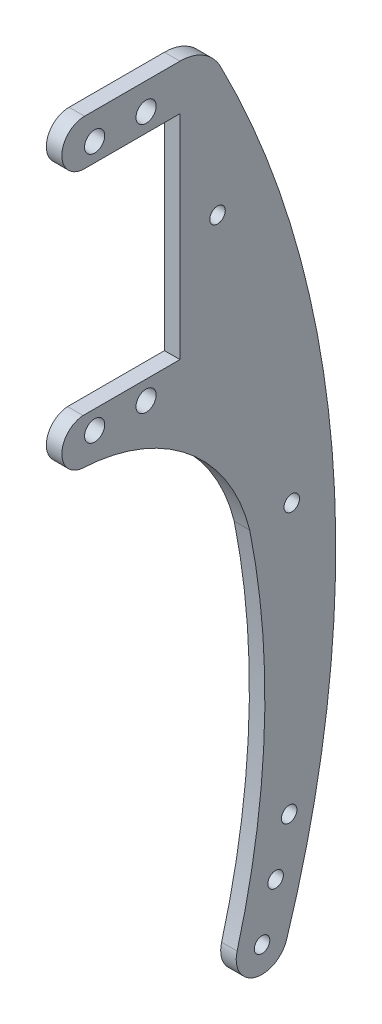
ISO-10303-21;
HEADER;
FILE_DESCRIPTION(('STEP AP214'),'2;1');
FILE_NAME('part.step','',(''),(''),'','','');
FILE_SCHEMA(('AUTOMOTIVE_DESIGN { 1 0 10303 214 1 1 1 1 }'));
ENDSEC;
DATA;
#1=APPLICATION_CONTEXT('core data for automotive mechanical design processes');
#2=APPLICATION_PROTOCOL_DEFINITION('international standard','automotive_design',2000,#1);
#3=PRODUCT_CONTEXT('',#1,'mechanical');
#4=PRODUCT('Part','Part','',(#3));
#5=PRODUCT_RELATED_PRODUCT_CATEGORY('part','',(#4));
#6=PRODUCT_DEFINITION_FORMATION('','',#4);
#7=PRODUCT_DEFINITION_CONTEXT('part definition',#1,'design');
#8=PRODUCT_DEFINITION('design','',#6,#7);
#9=PRODUCT_DEFINITION_SHAPE('','',#8);
#10=(LENGTH_UNIT() NAMED_UNIT(*) SI_UNIT(.MILLI.,.METRE.));
#11=(NAMED_UNIT(*) PLANE_ANGLE_UNIT() SI_UNIT($,.RADIAN.));
#12=(NAMED_UNIT(*) SI_UNIT($,.STERADIAN.) SOLID_ANGLE_UNIT());
#13=UNCERTAINTY_MEASURE_WITH_UNIT(LENGTH_MEASURE(1.E-05),#10,'distance_accuracy_value','');
#14=(GEOMETRIC_REPRESENTATION_CONTEXT(3) GLOBAL_UNCERTAINTY_ASSIGNED_CONTEXT((#13)) GLOBAL_UNIT_ASSIGNED_CONTEXT((#10,
#11,#12)) REPRESENTATION_CONTEXT('',''));
#15=CARTESIAN_POINT('',(0.,0.,0.));
#16=DIRECTION('',(0.,0.,1.));
#17=DIRECTION('',(1.,0.,0.));
#18=AXIS2_PLACEMENT_3D('',#15,#16,#17);
#19=CARTESIAN_POINT('',(3.,25.0125,6.925));
#20=DIRECTION('',(1.,0.,0.));
#21=DIRECTION('',(0.,0.,-1.));
#22=AXIS2_PLACEMENT_3D('',#19,#20,#21);
#23=PLANE('',#22);
#24=CARTESIAN_POINT('',(3.,-116.938856524657,-30.036135716593));
#25=DIRECTION('',(1.,0.,0.));
#26=DIRECTION('',(0.,0.,-1.));
#27=AXIS2_PLACEMENT_3D('',#24,#25,#26);
#28=CIRCLE('',#27,1.5);
#29=CARTESIAN_POINT('',(3.,-116.938856524657,-31.536135716593));
#30=VERTEX_POINT('',#29);
#31=EDGE_CURVE('E335',#30,#30,#28,.T.);
#32=ORIENTED_EDGE('',*,*,#31,.F.);
#33=EDGE_LOOP('',(#32));
#34=FACE_BOUND('',#33,.T.);
#35=CARTESIAN_POINT('',(3.,-55.4185287596542,-33.1598588616589));
#36=DIRECTION('',(1.,0.,0.));
#37=DIRECTION('',(0.,0.,-1.));
#38=AXIS2_PLACEMENT_3D('',#35,#36,#37);
#39=CIRCLE('',#38,1.5);
#40=CARTESIAN_POINT('',(3.,-55.4185287596542,-34.6598588616589));
#41=VERTEX_POINT('',#40);
#42=EDGE_CURVE('E351',#41,#41,#39,.T.);
#43=ORIENTED_EDGE('',*,*,#42,.F.);
#44=EDGE_LOOP('',(#43));
#45=FACE_BOUND('',#44,.T.);
#46=CARTESIAN_POINT('',(3.,-24.2125,4.975));
#47=DIRECTION('',(1.,0.,0.));
#48=DIRECTION('',(0.,0.,1.));
#49=AXIS2_PLACEMENT_3D('',#46,#47,#48);
#50=CIRCLE('',#49,1.95);
#51=CARTESIAN_POINT('',(3.,-24.2125,6.925));
#52=VERTEX_POINT('',#51);
#53=EDGE_CURVE('E367',#52,#52,#50,.T.);
#54=ORIENTED_EDGE('',*,*,#53,.F.);
#55=EDGE_LOOP('',(#54));
#56=FACE_BOUND('',#55,.T.);
#57=CARTESIAN_POINT('',(3.,24.2125,-4.975));
#58=DIRECTION('',(1.,0.,0.));
#59=DIRECTION('',(0.,0.,1.));
#60=AXIS2_PLACEMENT_3D('',#57,#58,#59);
#61=CIRCLE('',#60,1.95);
#62=CARTESIAN_POINT('',(3.,24.2125,-3.025));
#63=VERTEX_POINT('',#62);
#64=EDGE_CURVE('E383',#63,#63,#61,.T.);
#65=ORIENTED_EDGE('',*,*,#64,.F.);
#66=EDGE_LOOP('',(#65));
#67=FACE_BOUND('',#66,.T.);
#68=CARTESIAN_POINT('',(3.,25.0125,6.925));
#69=DIRECTION('',(1.,0.,0.));
#70=DIRECTION('',(0.,0.,-1.));
#71=AXIS2_PLACEMENT_3D('',#68,#69,#70);
#72=CIRCLE('',#71,4.4);
#73=CARTESIAN_POINT('',(3.,29.4125,6.925));
#74=VERTEX_POINT('',#73);
#75=CARTESIAN_POINT('',(3.,20.6125,6.925));
#76=VERTEX_POINT('',#75);
#77=EDGE_CURVE('E191',#74,#76,#72,.T.);
#78=ORIENTED_EDGE('',*,*,#77,.T.);
#79=DIRECTION('',(0.,0.,-1.));
#80=VECTOR('',#79,1.);
#81=CARTESIAN_POINT('',(3.,20.6125,6.925));
#82=LINE('',#81,#80);
#83=CARTESIAN_POINT('',(3.,20.6125,-11.525));
#84=VERTEX_POINT('',#83);
#85=EDGE_CURVE('E109',#76,#84,#82,.T.);
#86=ORIENTED_EDGE('',*,*,#85,.T.);
#87=DIRECTION('',(0.,-1.,0.));
#88=VECTOR('',#87,1.);
#89=CARTESIAN_POINT('',(3.,20.6125,-11.525));
#90=LINE('',#89,#88);
#91=CARTESIAN_POINT('',(3.,-20.5937907698934,-11.525));
#92=VERTEX_POINT('',#91);
#93=EDGE_CURVE('E224',#84,#92,#90,.T.);
#94=ORIENTED_EDGE('',*,*,#93,.T.);
#95=DIRECTION('',(0.,0.,1.));
#96=VECTOR('',#95,1.);
#97=CARTESIAN_POINT('',(3.,-20.5937907698934,7.21925667241328));
#98=LINE('',#97,#96);
#99=CARTESIAN_POINT('',(3.,-20.5937907698934,7.21925667241328));
#100=VERTEX_POINT('',#99);
#101=EDGE_CURVE('E244',#92,#100,#98,.T.);
#102=ORIENTED_EDGE('',*,*,#101,.T.);
#103=CARTESIAN_POINT('',(3.,-24.9839403129888,6.925));
#104=DIRECTION('',(1.,0.,0.));
#105=DIRECTION('',(0.,0.,1.));
#106=AXIS2_PLACEMENT_3D('',#103,#104,#105);
#107=CIRCLE('',#106,4.4);
#108=CARTESIAN_POINT('',(3.,-29.3740898560841,7.21925667241328));
#109=VERTEX_POINT('',#108);
#110=EDGE_CURVE('E240',#100,#109,#107,.T.);
#111=ORIENTED_EDGE('',*,*,#110,.T.);
#112=CARTESIAN_POINT('',(3.,-64.3313253612496,8.9489057224812));
#113=DIRECTION('',(-1.,0.,0.));
#114=DIRECTION('',(0.,0.,-1.));
#115=AXIS2_PLACEMENT_3D('',#112,#113,#114);
#116=CIRCLE('',#115,35.);
#117=CARTESIAN_POINT('',(3.,-55.9180653597128,-25.0248643972235));
#118=VERTEX_POINT('',#117);
#119=EDGE_CURVE('E243',#109,#118,#116,.T.);
#120=ORIENTED_EDGE('',*,*,#119,.T.);
#121=CARTESIAN_POINT('',(3.,-85.4486756139854,122.039553658302));
#122=DIRECTION('',(-1.,0.,0.));
#123=DIRECTION('',(0.,0.,-1.));
#124=AXIS2_PLACEMENT_3D('',#121,#122,#123);
#125=CIRCLE('',#124,150.);
#126=CARTESIAN_POINT('',(3.,-125.235333671732,-22.5876285744862));
#127=VERTEX_POINT('',#126);
#128=EDGE_CURVE('E248',#118,#127,#125,.T.);
#129=ORIENTED_EDGE('',*,*,#128,.T.);
#130=CARTESIAN_POINT('',(3.,-126.56155560699,-27.4085346489126));
#131=DIRECTION('',(1.,0.,0.));
#132=DIRECTION('',(0.,0.,-1.));
#133=AXIS2_PLACEMENT_3D('',#130,#131,#132);
#134=CIRCLE('',#133,5.00000000000009);
#135=CARTESIAN_POINT('',(3.,-128.084234421906,-32.17103916089));
#136=VERTEX_POINT('',#135);
#137=EDGE_CURVE('E137',#127,#136,#134,.T.);
#138=ORIENTED_EDGE('',*,*,#137,.T.);
#139=CARTESIAN_POINT('',(3.,-67.1770818252609,158.329141318208));
#140=DIRECTION('',(1.,0.,0.));
#141=DIRECTION('',(0.,0.,-1.));
#142=AXIS2_PLACEMENT_3D('',#139,#140,#141);
#143=CIRCLE('',#142,200.);
#144=CARTESIAN_POINT('',(3.,24.6530246865183,-19.3425546213401));
#145=VERTEX_POINT('',#144);
#146=EDGE_CURVE('E131',#136,#145,#143,.T.);
#147=ORIENTED_EDGE('',*,*,#146,.T.);
#148=CARTESIAN_POINT('',(3.,20.6125,-11.525));
#149=DIRECTION('',(1.,0.,0.));
#150=DIRECTION('',(0.,0.,1.));
#151=AXIS2_PLACEMENT_3D('',#148,#149,#150);
#152=CIRCLE('',#151,8.79999999999995);
#153=CARTESIAN_POINT('',(3.,29.4125,-11.525));
#154=VERTEX_POINT('',#153);
#155=EDGE_CURVE('E135',#145,#154,#152,.T.);
#156=ORIENTED_EDGE('',*,*,#155,.T.);
#157=DIRECTION('',(0.,0.,1.));
#158=VECTOR('',#157,1.);
#159=CARTESIAN_POINT('',(3.,29.4125,6.925));
#160=LINE('',#159,#158);
#161=EDGE_CURVE('E57',#154,#74,#160,.T.);
#162=ORIENTED_EDGE('',*,*,#161,.T.);
#163=EDGE_LOOP('',(#78,#86,#94,#102,#111,#120,#129,#138,#147,#156,#162));
#164=FACE_BOUND('',#163,.T.);
#165=CARTESIAN_POINT('',(3.,24.2125,4.975));
#166=DIRECTION('',(1.,0.,0.));
#167=DIRECTION('',(0.,0.,-1.));
#168=AXIS2_PLACEMENT_3D('',#165,#166,#167);
#169=CIRCLE('',#168,1.95);
#170=CARTESIAN_POINT('',(3.,24.2125,3.025));
#171=VERTEX_POINT('',#170);
#172=EDGE_CURVE('E164',#171,#171,#169,.T.);
#173=ORIENTED_EDGE('',*,*,#172,.F.);
#174=EDGE_LOOP('',(#173));
#175=FACE_BOUND('',#174,.T.);
#176=CARTESIAN_POINT('',(3.,-24.2125,-4.975));
#177=DIRECTION('',(1.,0.,0.));
#178=DIRECTION('',(0.,0.,-1.));
#179=AXIS2_PLACEMENT_3D('',#176,#177,#178);
#180=CIRCLE('',#179,1.95);
#181=CARTESIAN_POINT('',(3.,-24.2125,-6.925));
#182=VERTEX_POINT('',#181);
#183=EDGE_CURVE('E375',#182,#182,#180,.T.);
#184=ORIENTED_EDGE('',*,*,#183,.F.);
#185=EDGE_LOOP('',(#184));
#186=FACE_BOUND('',#185,.T.);
#187=CARTESIAN_POINT('',(3.,0.,-18.795));
#188=DIRECTION('',(1.,0.,0.));
#189=DIRECTION('',(0.,0.,-1.));
#190=AXIS2_PLACEMENT_3D('',#187,#188,#189);
#191=CIRCLE('',#190,1.5);
#192=CARTESIAN_POINT('',(3.,0.,-20.295));
#193=VERTEX_POINT('',#192);
#194=EDGE_CURVE('E359',#193,#193,#191,.T.);
#195=ORIENTED_EDGE('',*,*,#194,.F.);
#196=EDGE_LOOP('',(#195));
#197=FACE_BOUND('',#196,.T.);
#198=CARTESIAN_POINT('',(3.,-107.316157442325,-32.6637367842734));
#199=DIRECTION('',(1.,0.,0.));
#200=DIRECTION('',(0.,0.,-1.));
#201=AXIS2_PLACEMENT_3D('',#198,#199,#200);
#202=CIRCLE('',#201,1.49999999999999);
#203=CARTESIAN_POINT('',(3.,-107.316157442325,-34.1637367842734));
#204=VERTEX_POINT('',#203);
#205=EDGE_CURVE('E343',#204,#204,#202,.T.);
#206=ORIENTED_EDGE('',*,*,#205,.F.);
#207=EDGE_LOOP('',(#206));
#208=FACE_BOUND('',#207,.T.);
#209=CARTESIAN_POINT('',(3.,-126.56155560699,-27.4085346489126));
#210=DIRECTION('',(1.,0.,0.));
#211=DIRECTION('',(0.,0.,-1.));
#212=AXIS2_PLACEMENT_3D('',#209,#210,#211);
#213=CIRCLE('',#212,1.5);
#214=CARTESIAN_POINT('',(3.,-126.56155560699,-28.9085346489126));
#215=VERTEX_POINT('',#214);
#216=EDGE_CURVE('E324',#215,#215,#213,.T.);
#217=ORIENTED_EDGE('',*,*,#216,.F.);
#218=EDGE_LOOP('',(#217));
#219=FACE_BOUND('',#218,.T.);
#220=ADVANCED_FACE('F39',(#34,#45,#56,#67,#164,#175,#186,#197,#208,#219),#23,.T.);
#221=CARTESIAN_POINT('',(0.,25.0125,6.925));
#222=DIRECTION('',(1.,0.,0.));
#223=DIRECTION('',(0.,0.,-1.));
#224=AXIS2_PLACEMENT_3D('',#221,#222,#223);
#225=PLANE('',#224);
#226=CARTESIAN_POINT('',(0.,25.0125,6.925));
#227=DIRECTION('',(1.,0.,0.));
#228=DIRECTION('',(0.,0.,-1.));
#229=AXIS2_PLACEMENT_3D('',#226,#227,#228);
#230=CIRCLE('',#229,4.4);
#231=CARTESIAN_POINT('',(0.,29.4125,6.925));
#232=VERTEX_POINT('',#231);
#233=CARTESIAN_POINT('',(0.,20.6125,6.925));
#234=VERTEX_POINT('',#233);
#235=EDGE_CURVE('E159',#232,#234,#230,.T.);
#236=ORIENTED_EDGE('',*,*,#235,.F.);
#237=DIRECTION('',(0.,0.,1.));
#238=VECTOR('',#237,1.);
#239=CARTESIAN_POINT('',(0.,29.4125,6.925));
#240=LINE('',#239,#238);
#241=CARTESIAN_POINT('',(0.,29.4125,-11.525));
#242=VERTEX_POINT('',#241);
#243=EDGE_CURVE('E101',#242,#232,#240,.T.);
#244=ORIENTED_EDGE('',*,*,#243,.F.);
#245=CARTESIAN_POINT('',(0.,20.6125,-11.525));
#246=DIRECTION('',(1.,0.,0.));
#247=DIRECTION('',(0.,0.,1.));
#248=AXIS2_PLACEMENT_3D('',#245,#246,#247);
#249=CIRCLE('',#248,8.79999999999995);
#250=CARTESIAN_POINT('',(0.,24.6530246865183,-19.3425546213401));
#251=VERTEX_POINT('',#250);
#252=EDGE_CURVE('E95',#251,#242,#249,.T.);
#253=ORIENTED_EDGE('',*,*,#252,.F.);
#254=CARTESIAN_POINT('',(0.,-67.1770818252609,158.329141318208));
#255=DIRECTION('',(1.,0.,0.));
#256=DIRECTION('',(0.,0.,-1.));
#257=AXIS2_PLACEMENT_3D('',#254,#255,#256);
#258=CIRCLE('',#257,200.);
#259=CARTESIAN_POINT('',(0.,-128.084234421906,-32.17103916089));
#260=VERTEX_POINT('',#259);
#261=EDGE_CURVE('E146',#260,#251,#258,.T.);
#262=ORIENTED_EDGE('',*,*,#261,.F.);
#263=CARTESIAN_POINT('',(0.,-126.56155560699,-27.4085346489126));
#264=DIRECTION('',(1.,0.,0.));
#265=DIRECTION('',(0.,0.,-1.));
#266=AXIS2_PLACEMENT_3D('',#263,#264,#265);
#267=CIRCLE('',#266,5.00000000000009);
#268=CARTESIAN_POINT('',(0.,-125.235333671732,-22.5876285744862));
#269=VERTEX_POINT('',#268);
#270=EDGE_CURVE('E182',#269,#260,#267,.T.);
#271=ORIENTED_EDGE('',*,*,#270,.F.);
#272=CARTESIAN_POINT('',(0.,-85.4486756139854,122.039553658302));
#273=DIRECTION('',(-1.,0.,0.));
#274=DIRECTION('',(0.,0.,-1.));
#275=AXIS2_PLACEMENT_3D('',#272,#273,#274);
#276=CIRCLE('',#275,150.);
#277=CARTESIAN_POINT('',(0.,-55.9180653597128,-25.0248643972235));
#278=VERTEX_POINT('',#277);
#279=EDGE_CURVE('E179',#278,#269,#276,.T.);
#280=ORIENTED_EDGE('',*,*,#279,.F.);
#281=CARTESIAN_POINT('',(0.,-64.3313253612496,8.9489057224812));
#282=DIRECTION('',(-1.,0.,0.));
#283=DIRECTION('',(0.,0.,-1.));
#284=AXIS2_PLACEMENT_3D('',#281,#282,#283);
#285=CIRCLE('',#284,35.);
#286=CARTESIAN_POINT('',(0.,-29.3740898560841,7.21925667241328));
#287=VERTEX_POINT('',#286);
#288=EDGE_CURVE('E176',#287,#278,#285,.T.);
#289=ORIENTED_EDGE('',*,*,#288,.F.);
#290=CARTESIAN_POINT('',(0.,-24.9839403129888,6.925));
#291=DIRECTION('',(1.,0.,0.));
#292=DIRECTION('',(0.,0.,1.));
#293=AXIS2_PLACEMENT_3D('',#290,#291,#292);
#294=CIRCLE('',#293,4.4);
#295=CARTESIAN_POINT('',(0.,-20.5937907698934,7.21925667241328));
#296=VERTEX_POINT('',#295);
#297=EDGE_CURVE('E173',#296,#287,#294,.T.);
#298=ORIENTED_EDGE('',*,*,#297,.F.);
#299=DIRECTION('',(0.,0.,1.));
#300=VECTOR('',#299,1.);
#301=CARTESIAN_POINT('',(0.,-20.5937907698934,7.21925667241328));
#302=LINE('',#301,#300);
#303=CARTESIAN_POINT('',(0.,-20.5937907698934,-11.525));
#304=VERTEX_POINT('',#303);
#305=EDGE_CURVE('E170',#304,#296,#302,.T.);
#306=ORIENTED_EDGE('',*,*,#305,.F.);
#307=DIRECTION('',(0.,-1.,0.));
#308=VECTOR('',#307,1.);
#309=CARTESIAN_POINT('',(0.,20.6125,-11.525));
#310=LINE('',#309,#308);
#311=CARTESIAN_POINT('',(0.,20.6125,-11.525));
#312=VERTEX_POINT('',#311);
#313=EDGE_CURVE('E167',#312,#304,#310,.T.);
#314=ORIENTED_EDGE('',*,*,#313,.F.);
#315=DIRECTION('',(0.,0.,-1.));
#316=VECTOR('',#315,1.);
#317=CARTESIAN_POINT('',(0.,20.6125,6.925));
#318=LINE('',#317,#316);
#319=EDGE_CURVE('E163',#234,#312,#318,.T.);
#320=ORIENTED_EDGE('',*,*,#319,.F.);
#321=EDGE_LOOP('',(#236,#244,#253,#262,#271,#280,#289,#298,#306,#314,#320));
#322=FACE_BOUND('',#321,.T.);
#323=CARTESIAN_POINT('',(0.,24.2125,4.975));
#324=DIRECTION('',(1.,0.,0.));
#325=DIRECTION('',(0.,0.,-1.));
#326=AXIS2_PLACEMENT_3D('',#323,#324,#325);
#327=CIRCLE('',#326,1.95);
#328=CARTESIAN_POINT('',(0.,24.2125,3.025));
#329=VERTEX_POINT('',#328);
#330=EDGE_CURVE('E387',#329,#329,#327,.T.);
#331=ORIENTED_EDGE('',*,*,#330,.T.);
#332=EDGE_LOOP('',(#331));
#333=FACE_BOUND('',#332,.T.);
#334=CARTESIAN_POINT('',(0.,24.2125,-4.975));
#335=DIRECTION('',(1.,0.,0.));
#336=DIRECTION('',(0.,0.,1.));
#337=AXIS2_PLACEMENT_3D('',#334,#335,#336);
#338=CIRCLE('',#337,1.95);
#339=CARTESIAN_POINT('',(0.,24.2125,-3.025));
#340=VERTEX_POINT('',#339);
#341=EDGE_CURVE('E379',#340,#340,#338,.T.);
#342=ORIENTED_EDGE('',*,*,#341,.T.);
#343=EDGE_LOOP('',(#342));
#344=FACE_BOUND('',#343,.T.);
#345=CARTESIAN_POINT('',(0.,-24.2125,-4.975));
#346=DIRECTION('',(1.,0.,0.));
#347=DIRECTION('',(0.,0.,-1.));
#348=AXIS2_PLACEMENT_3D('',#345,#346,#347);
#349=CIRCLE('',#348,1.95);
#350=CARTESIAN_POINT('',(0.,-24.2125,-6.925));
#351=VERTEX_POINT('',#350);
#352=EDGE_CURVE('E371',#351,#351,#349,.T.);
#353=ORIENTED_EDGE('',*,*,#352,.T.);
#354=EDGE_LOOP('',(#353));
#355=FACE_BOUND('',#354,.T.);
#356=CARTESIAN_POINT('',(0.,-24.2125,4.975));
#357=DIRECTION('',(1.,0.,0.));
#358=DIRECTION('',(0.,0.,1.));
#359=AXIS2_PLACEMENT_3D('',#356,#357,#358);
#360=CIRCLE('',#359,1.95);
#361=CARTESIAN_POINT('',(0.,-24.2125,6.925));
#362=VERTEX_POINT('',#361);
#363=EDGE_CURVE('E363',#362,#362,#360,.T.);
#364=ORIENTED_EDGE('',*,*,#363,.T.);
#365=EDGE_LOOP('',(#364));
#366=FACE_BOUND('',#365,.T.);
#367=CARTESIAN_POINT('',(0.,0.,-18.795));
#368=DIRECTION('',(1.,0.,0.));
#369=DIRECTION('',(0.,0.,-1.));
#370=AXIS2_PLACEMENT_3D('',#367,#368,#369);
#371=CIRCLE('',#370,1.5);
#372=CARTESIAN_POINT('',(0.,0.,-20.295));
#373=VERTEX_POINT('',#372);
#374=EDGE_CURVE('E355',#373,#373,#371,.T.);
#375=ORIENTED_EDGE('',*,*,#374,.T.);
#376=EDGE_LOOP('',(#375));
#377=FACE_BOUND('',#376,.T.);
#378=CARTESIAN_POINT('',(0.,-55.4185287596542,-33.1598588616589));
#379=DIRECTION('',(1.,0.,0.));
#380=DIRECTION('',(0.,0.,-1.));
#381=AXIS2_PLACEMENT_3D('',#378,#379,#380);
#382=CIRCLE('',#381,1.5);
#383=CARTESIAN_POINT('',(0.,-55.4185287596542,-34.6598588616589));
#384=VERTEX_POINT('',#383);
#385=EDGE_CURVE('E347',#384,#384,#382,.T.);
#386=ORIENTED_EDGE('',*,*,#385,.T.);
#387=EDGE_LOOP('',(#386));
#388=FACE_BOUND('',#387,.T.);
#389=CARTESIAN_POINT('',(0.,-107.316157442325,-32.6637367842734));
#390=DIRECTION('',(1.,0.,0.));
#391=DIRECTION('',(0.,0.,-1.));
#392=AXIS2_PLACEMENT_3D('',#389,#390,#391);
#393=CIRCLE('',#392,1.49999999999999);
#394=CARTESIAN_POINT('',(0.,-107.316157442325,-34.1637367842734));
#395=VERTEX_POINT('',#394);
#396=EDGE_CURVE('E339',#395,#395,#393,.T.);
#397=ORIENTED_EDGE('',*,*,#396,.T.);
#398=EDGE_LOOP('',(#397));
#399=FACE_BOUND('',#398,.T.);
#400=CARTESIAN_POINT('',(0.,-116.938856524657,-30.036135716593));
#401=DIRECTION('',(1.,0.,0.));
#402=DIRECTION('',(0.,0.,-1.));
#403=AXIS2_PLACEMENT_3D('',#400,#401,#402);
#404=CIRCLE('',#403,1.5);
#405=CARTESIAN_POINT('',(0.,-116.938856524657,-31.536135716593));
#406=VERTEX_POINT('',#405);
#407=EDGE_CURVE('E332',#406,#406,#404,.T.);
#408=ORIENTED_EDGE('',*,*,#407,.T.);
#409=EDGE_LOOP('',(#408));
#410=FACE_BOUND('',#409,.T.);
#411=CARTESIAN_POINT('',(0.,-126.56155560699,-27.4085346489126));
#412=DIRECTION('',(1.,0.,0.));
#413=DIRECTION('',(0.,0.,-1.));
#414=AXIS2_PLACEMENT_3D('',#411,#412,#413);
#415=CIRCLE('',#414,1.5);
#416=CARTESIAN_POINT('',(0.,-126.56155560699,-28.9085346489126));
#417=VERTEX_POINT('',#416);
#418=EDGE_CURVE('E327',#417,#417,#415,.T.);
#419=ORIENTED_EDGE('',*,*,#418,.T.);
#420=EDGE_LOOP('',(#419));
#421=FACE_BOUND('',#420,.T.);
#422=ADVANCED_FACE('F228',(#322,#333,#344,#355,#366,#377,#388,#399,#410,#421),#225,.F.);
#423=CARTESIAN_POINT('',(3.,25.0125,6.925));
#424=DIRECTION('',(-1.,0.,0.));
#425=DIRECTION('',(0.,0.,1.));
#426=AXIS2_PLACEMENT_3D('',#423,#424,#425);
#427=CYLINDRICAL_SURFACE('',#426,4.4);
#428=ORIENTED_EDGE('',*,*,#235,.T.);
#429=DIRECTION('',(-1.,0.,0.));
#430=VECTOR('',#429,1.);
#431=CARTESIAN_POINT('',(3.,20.6125,6.925));
#432=LINE('',#431,#430);
#433=EDGE_CURVE('E11',#76,#234,#432,.T.);
#434=ORIENTED_EDGE('',*,*,#433,.F.);
#435=ORIENTED_EDGE('',*,*,#77,.F.);
#436=DIRECTION('',(-1.,0.,0.));
#437=VECTOR('',#436,1.);
#438=CARTESIAN_POINT('',(3.,29.4125,6.925));
#439=LINE('',#438,#437);
#440=EDGE_CURVE('E155',#74,#232,#439,.T.);
#441=ORIENTED_EDGE('',*,*,#440,.T.);
#442=EDGE_LOOP('',(#428,#434,#435,#441));
#443=FACE_BOUND('',#442,.T.);
#444=ADVANCED_FACE('F41',(#443),#427,.T.);
#445=CARTESIAN_POINT('',(3.,20.6125,6.925));
#446=DIRECTION('',(0.,1.,0.));
#447=DIRECTION('',(0.,0.,1.));
#448=AXIS2_PLACEMENT_3D('',#445,#446,#447);
#449=PLANE('',#448);
#450=ORIENTED_EDGE('',*,*,#319,.T.);
#451=DIRECTION('',(-1.,0.,0.));
#452=VECTOR('',#451,1.);
#453=CARTESIAN_POINT('',(3.,20.6125,-11.525));
#454=LINE('',#453,#452);
#455=EDGE_CURVE('E49',#84,#312,#454,.T.);
#456=ORIENTED_EDGE('',*,*,#455,.F.);
#457=ORIENTED_EDGE('',*,*,#85,.F.);
#458=ORIENTED_EDGE('',*,*,#433,.T.);
#459=EDGE_LOOP('',(#450,#456,#457,#458));
#460=FACE_BOUND('',#459,.T.);
#461=ADVANCED_FACE('F538',(#460),#449,.F.);
#462=CARTESIAN_POINT('',(3.,20.6125,-11.525));
#463=DIRECTION('',(0.,0.,-1.));
#464=DIRECTION('',(0.,1.,0.));
#465=AXIS2_PLACEMENT_3D('',#462,#463,#464);
#466=PLANE('',#465);
#467=ORIENTED_EDGE('',*,*,#313,.T.);
#468=DIRECTION('',(-1.,0.,0.));
#469=VECTOR('',#468,1.);
#470=CARTESIAN_POINT('',(3.,-20.5937907698934,-11.525));
#471=LINE('',#470,#469);
#472=EDGE_CURVE('E214',#92,#304,#471,.T.);
#473=ORIENTED_EDGE('',*,*,#472,.F.);
#474=ORIENTED_EDGE('',*,*,#93,.F.);
#475=ORIENTED_EDGE('',*,*,#455,.T.);
#476=EDGE_LOOP('',(#467,#473,#474,#475));
#477=FACE_BOUND('',#476,.T.);
#478=ADVANCED_FACE('F222',(#477),#466,.F.);
#479=CARTESIAN_POINT('',(3.,-20.5937907698934,7.21925667241328));
#480=DIRECTION('',(0.,-1.,0.));
#481=DIRECTION('',(0.,0.,-1.));
#482=AXIS2_PLACEMENT_3D('',#479,#480,#481);
#483=PLANE('',#482);
#484=ORIENTED_EDGE('',*,*,#305,.T.);
#485=DIRECTION('',(-1.,0.,0.));
#486=VECTOR('',#485,1.);
#487=CARTESIAN_POINT('',(3.,-20.5937907698934,7.21925667241328));
#488=LINE('',#487,#486);
#489=EDGE_CURVE('E210',#100,#296,#488,.T.);
#490=ORIENTED_EDGE('',*,*,#489,.F.);
#491=ORIENTED_EDGE('',*,*,#101,.F.);
#492=ORIENTED_EDGE('',*,*,#472,.T.);
#493=EDGE_LOOP('',(#484,#490,#491,#492));
#494=FACE_BOUND('',#493,.T.);
#495=ADVANCED_FACE('F234',(#494),#483,.F.);
#496=CARTESIAN_POINT('',(3.,-24.9839403129888,6.925));
#497=DIRECTION('',(-1.,0.,0.));
#498=DIRECTION('',(0.,0.,1.));
#499=AXIS2_PLACEMENT_3D('',#496,#497,#498);
#500=CYLINDRICAL_SURFACE('',#499,4.4);
#501=ORIENTED_EDGE('',*,*,#297,.T.);
#502=DIRECTION('',(-1.,0.,0.));
#503=VECTOR('',#502,1.);
#504=CARTESIAN_POINT('',(3.,-29.3740898560841,7.21925667241328));
#505=LINE('',#504,#503);
#506=EDGE_CURVE('E206',#109,#287,#505,.T.);
#507=ORIENTED_EDGE('',*,*,#506,.F.);
#508=ORIENTED_EDGE('',*,*,#110,.F.);
#509=ORIENTED_EDGE('',*,*,#489,.T.);
#510=EDGE_LOOP('',(#501,#507,#508,#509));
#511=FACE_BOUND('',#510,.T.);
#512=ADVANCED_FACE('F238',(#511),#500,.T.);
#513=CARTESIAN_POINT('',(3.,-64.3313253612496,8.9489057224812));
#514=DIRECTION('',(-1.,0.,0.));
#515=DIRECTION('',(0.,0.,1.));
#516=AXIS2_PLACEMENT_3D('',#513,#514,#515);
#517=CYLINDRICAL_SURFACE('',#516,35.);
#518=ORIENTED_EDGE('',*,*,#288,.T.);
#519=DIRECTION('',(-1.,0.,0.));
#520=VECTOR('',#519,1.);
#521=CARTESIAN_POINT('',(3.,-55.9180653597128,-25.0248643972235));
#522=LINE('',#521,#520);
#523=EDGE_CURVE('E202',#118,#278,#522,.T.);
#524=ORIENTED_EDGE('',*,*,#523,.F.);
#525=ORIENTED_EDGE('',*,*,#119,.F.);
#526=ORIENTED_EDGE('',*,*,#506,.T.);
#527=EDGE_LOOP('',(#518,#524,#525,#526));
#528=FACE_BOUND('',#527,.T.);
#529=ADVANCED_FACE('F504',(#528),#517,.F.);
#530=CARTESIAN_POINT('',(3.,-85.4486756139854,122.039553658302));
#531=DIRECTION('',(-1.,0.,0.));
#532=DIRECTION('',(0.,0.,1.));
#533=AXIS2_PLACEMENT_3D('',#530,#531,#532);
#534=CYLINDRICAL_SURFACE('',#533,150.);
#535=ORIENTED_EDGE('',*,*,#279,.T.);
#536=DIRECTION('',(-1.,0.,0.));
#537=VECTOR('',#536,1.);
#538=CARTESIAN_POINT('',(3.,-125.235333671732,-22.5876285744862));
#539=LINE('',#538,#537);
#540=EDGE_CURVE('E198',#127,#269,#539,.T.);
#541=ORIENTED_EDGE('',*,*,#540,.F.);
#542=ORIENTED_EDGE('',*,*,#128,.F.);
#543=ORIENTED_EDGE('',*,*,#523,.T.);
#544=EDGE_LOOP('',(#535,#541,#542,#543));
#545=FACE_BOUND('',#544,.T.);
#546=ADVANCED_FACE('F259',(#545),#534,.F.);
#547=CARTESIAN_POINT('',(3.,-126.56155560699,-27.4085346489126));
#548=DIRECTION('',(-1.,0.,0.));
#549=DIRECTION('',(0.,0.,1.));
#550=AXIS2_PLACEMENT_3D('',#547,#548,#549);
#551=CYLINDRICAL_SURFACE('',#550,5.00000000000009);
#552=ORIENTED_EDGE('',*,*,#270,.T.);
#553=DIRECTION('',(-1.,0.,0.));
#554=VECTOR('',#553,1.);
#555=CARTESIAN_POINT('',(3.,-128.084234421906,-32.17103916089));
#556=LINE('',#555,#554);
#557=EDGE_CURVE('E148',#136,#260,#556,.T.);
#558=ORIENTED_EDGE('',*,*,#557,.F.);
#559=ORIENTED_EDGE('',*,*,#137,.F.);
#560=ORIENTED_EDGE('',*,*,#540,.T.);
#561=EDGE_LOOP('',(#552,#558,#559,#560));
#562=FACE_BOUND('',#561,.T.);
#563=ADVANCED_FACE('F263',(#562),#551,.T.);
#564=CARTESIAN_POINT('',(3.,-67.1770818252609,158.329141318208));
#565=DIRECTION('',(-1.,0.,0.));
#566=DIRECTION('',(0.,0.,1.));
#567=AXIS2_PLACEMENT_3D('',#564,#565,#566);
#568=CYLINDRICAL_SURFACE('',#567,200.);
#569=ORIENTED_EDGE('',*,*,#261,.T.);
#570=DIRECTION('',(-1.,0.,0.));
#571=VECTOR('',#570,1.);
#572=CARTESIAN_POINT('',(3.,24.6530246865183,-19.3425546213401));
#573=LINE('',#572,#571);
#574=EDGE_CURVE('E143',#145,#251,#573,.T.);
#575=ORIENTED_EDGE('',*,*,#574,.F.);
#576=ORIENTED_EDGE('',*,*,#146,.F.);
#577=ORIENTED_EDGE('',*,*,#557,.T.);
#578=EDGE_LOOP('',(#569,#575,#576,#577));
#579=FACE_BOUND('',#578,.T.);
#580=ADVANCED_FACE('F144',(#579),#568,.T.);
#581=CARTESIAN_POINT('',(3.,20.6125,-11.525));
#582=DIRECTION('',(-1.,0.,0.));
#583=DIRECTION('',(0.,0.,1.));
#584=AXIS2_PLACEMENT_3D('',#581,#582,#583);
#585=CYLINDRICAL_SURFACE('',#584,8.79999999999995);
#586=ORIENTED_EDGE('',*,*,#252,.T.);
#587=DIRECTION('',(-1.,0.,0.));
#588=VECTOR('',#587,1.);
#589=CARTESIAN_POINT('',(3.,29.4125,-11.525));
#590=LINE('',#589,#588);
#591=EDGE_CURVE('E149',#154,#242,#590,.T.);
#592=ORIENTED_EDGE('',*,*,#591,.F.);
#593=ORIENTED_EDGE('',*,*,#155,.F.);
#594=ORIENTED_EDGE('',*,*,#574,.T.);
#595=EDGE_LOOP('',(#586,#592,#593,#594));
#596=FACE_BOUND('',#595,.T.);
#597=ADVANCED_FACE('F151',(#596),#585,.T.);
#598=CARTESIAN_POINT('',(3.,29.4125,6.925));
#599=DIRECTION('',(0.,-1.,0.));
#600=DIRECTION('',(0.,0.,-1.));
#601=AXIS2_PLACEMENT_3D('',#598,#599,#600);
#602=PLANE('',#601);
#603=ORIENTED_EDGE('',*,*,#243,.T.);
#604=ORIENTED_EDGE('',*,*,#440,.F.);
#605=ORIENTED_EDGE('',*,*,#161,.F.);
#606=ORIENTED_EDGE('',*,*,#591,.T.);
#607=EDGE_LOOP('',(#603,#604,#605,#606));
#608=FACE_BOUND('',#607,.T.);
#609=ADVANCED_FACE('F267',(#608),#602,.F.);
#610=CARTESIAN_POINT('',(3.,24.2125,4.975));
#611=DIRECTION('',(-1.,0.,0.));
#612=DIRECTION('',(0.,0.,1.));
#613=AXIS2_PLACEMENT_3D('',#610,#611,#612);
#614=CYLINDRICAL_SURFACE('',#613,1.95);
#615=ORIENTED_EDGE('',*,*,#172,.T.);
#616=EDGE_LOOP('',(#615));
#617=FACE_BOUND('',#616,.T.);
#618=ORIENTED_EDGE('',*,*,#330,.F.);
#619=EDGE_LOOP('',(#618));
#620=FACE_BOUND('',#619,.T.);
#621=ADVANCED_FACE('F269',(#617,#620),#614,.F.);
#622=CARTESIAN_POINT('',(3.,24.2125,-4.975));
#623=DIRECTION('',(-1.,0.,0.));
#624=DIRECTION('',(0.,0.,1.));
#625=AXIS2_PLACEMENT_3D('',#622,#623,#624);
#626=CYLINDRICAL_SURFACE('',#625,1.95);
#627=ORIENTED_EDGE('',*,*,#64,.T.);
#628=EDGE_LOOP('',(#627));
#629=FACE_BOUND('',#628,.T.);
#630=ORIENTED_EDGE('',*,*,#341,.F.);
#631=EDGE_LOOP('',(#630));
#632=FACE_BOUND('',#631,.T.);
#633=ADVANCED_FACE('F275',(#629,#632),#626,.F.);
#634=CARTESIAN_POINT('',(3.,-24.2125,-4.975));
#635=DIRECTION('',(-1.,0.,0.));
#636=DIRECTION('',(0.,0.,1.));
#637=AXIS2_PLACEMENT_3D('',#634,#635,#636);
#638=CYLINDRICAL_SURFACE('',#637,1.95);
#639=ORIENTED_EDGE('',*,*,#183,.T.);
#640=EDGE_LOOP('',(#639));
#641=FACE_BOUND('',#640,.T.);
#642=ORIENTED_EDGE('',*,*,#352,.F.);
#643=EDGE_LOOP('',(#642));
#644=FACE_BOUND('',#643,.T.);
#645=ADVANCED_FACE('F291',(#641,#644),#638,.F.);
#646=CARTESIAN_POINT('',(3.,-24.2125,4.975));
#647=DIRECTION('',(-1.,0.,0.));
#648=DIRECTION('',(0.,0.,1.));
#649=AXIS2_PLACEMENT_3D('',#646,#647,#648);
#650=CYLINDRICAL_SURFACE('',#649,1.95);
#651=ORIENTED_EDGE('',*,*,#53,.T.);
#652=EDGE_LOOP('',(#651));
#653=FACE_BOUND('',#652,.T.);
#654=ORIENTED_EDGE('',*,*,#363,.F.);
#655=EDGE_LOOP('',(#654));
#656=FACE_BOUND('',#655,.T.);
#657=ADVANCED_FACE('F295',(#653,#656),#650,.F.);
#658=CARTESIAN_POINT('',(3.,0.,-18.795));
#659=DIRECTION('',(-1.,0.,0.));
#660=DIRECTION('',(0.,0.,1.));
#661=AXIS2_PLACEMENT_3D('',#658,#659,#660);
#662=CYLINDRICAL_SURFACE('',#661,1.5);
#663=ORIENTED_EDGE('',*,*,#194,.T.);
#664=EDGE_LOOP('',(#663));
#665=FACE_BOUND('',#664,.T.);
#666=ORIENTED_EDGE('',*,*,#374,.F.);
#667=EDGE_LOOP('',(#666));
#668=FACE_BOUND('',#667,.T.);
#669=ADVANCED_FACE('F299',(#665,#668),#662,.F.);
#670=CARTESIAN_POINT('',(3.,-55.4185287596542,-33.1598588616589));
#671=DIRECTION('',(-1.,0.,0.));
#672=DIRECTION('',(0.,0.,1.));
#673=AXIS2_PLACEMENT_3D('',#670,#671,#672);
#674=CYLINDRICAL_SURFACE('',#673,1.5);
#675=ORIENTED_EDGE('',*,*,#42,.T.);
#676=EDGE_LOOP('',(#675));
#677=FACE_BOUND('',#676,.T.);
#678=ORIENTED_EDGE('',*,*,#385,.F.);
#679=EDGE_LOOP('',(#678));
#680=FACE_BOUND('',#679,.T.);
#681=ADVANCED_FACE('F303',(#677,#680),#674,.F.);
#682=CARTESIAN_POINT('',(3.,-107.316157442325,-32.6637367842734));
#683=DIRECTION('',(-1.,0.,0.));
#684=DIRECTION('',(0.,0.,1.));
#685=AXIS2_PLACEMENT_3D('',#682,#683,#684);
#686=CYLINDRICAL_SURFACE('',#685,1.49999999999999);
#687=ORIENTED_EDGE('',*,*,#205,.T.);
#688=EDGE_LOOP('',(#687));
#689=FACE_BOUND('',#688,.T.);
#690=ORIENTED_EDGE('',*,*,#396,.F.);
#691=EDGE_LOOP('',(#690));
#692=FACE_BOUND('',#691,.T.);
#693=ADVANCED_FACE('F307',(#689,#692),#686,.F.);
#694=CARTESIAN_POINT('',(3.,-116.938856524657,-30.036135716593));
#695=DIRECTION('',(-1.,0.,0.));
#696=DIRECTION('',(0.,0.,1.));
#697=AXIS2_PLACEMENT_3D('',#694,#695,#696);
#698=CYLINDRICAL_SURFACE('',#697,1.5);
#699=ORIENTED_EDGE('',*,*,#31,.T.);
#700=EDGE_LOOP('',(#699));
#701=FACE_BOUND('',#700,.T.);
#702=ORIENTED_EDGE('',*,*,#407,.F.);
#703=EDGE_LOOP('',(#702));
#704=FACE_BOUND('',#703,.T.);
#705=ADVANCED_FACE('F311',(#701,#704),#698,.F.);
#706=CARTESIAN_POINT('',(3.,-126.56155560699,-27.4085346489126));
#707=DIRECTION('',(-1.,0.,0.));
#708=DIRECTION('',(0.,0.,1.));
#709=AXIS2_PLACEMENT_3D('',#706,#707,#708);
#710=CYLINDRICAL_SURFACE('',#709,1.5);
#711=ORIENTED_EDGE('',*,*,#216,.T.);
#712=EDGE_LOOP('',(#711));
#713=FACE_BOUND('',#712,.T.);
#714=ORIENTED_EDGE('',*,*,#418,.F.);
#715=EDGE_LOOP('',(#714));
#716=FACE_BOUND('',#715,.T.);
#717=ADVANCED_FACE('F315',(#713,#716),#710,.F.);
#718=CLOSED_SHELL('',(#220,#422,#444,#461,#478,#495,#512,#529,#546,#563,#580,#597,#609,#621,
#633,#645,#657,#669,#681,#693,#705,#717));
#719=MANIFOLD_SOLID_BREP('B2',#718);
#720=ADVANCED_BREP_SHAPE_REPRESENTATION('',(#18,#719),#14);
#721=SHAPE_DEFINITION_REPRESENTATION(#9,#720);
ENDSEC;
END-ISO-10303-21;
